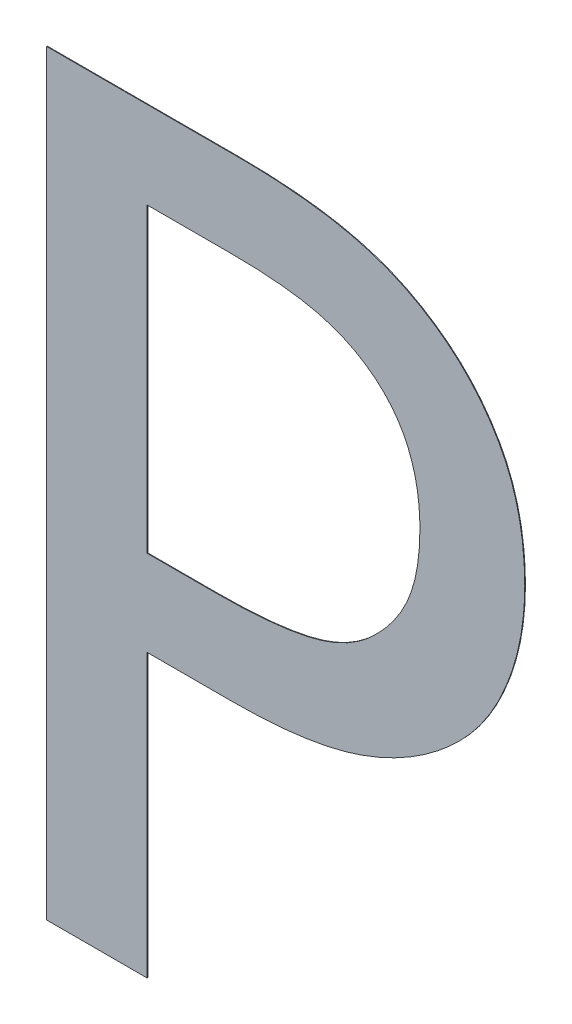
ISO-10303-21;
HEADER;
FILE_DESCRIPTION(('STEP AP214'),'2;1');
FILE_NAME('part.step','',(''),(''),'','','');
FILE_SCHEMA(('AUTOMOTIVE_DESIGN { 1 0 10303 214 1 1 1 1 }'));
ENDSEC;
DATA;
#1=APPLICATION_CONTEXT('core data for automotive mechanical design processes');
#2=APPLICATION_PROTOCOL_DEFINITION('international standard','automotive_design',2000,#1);
#3=PRODUCT_CONTEXT('',#1,'mechanical');
#4=PRODUCT('Part','Part','',(#3));
#5=PRODUCT_RELATED_PRODUCT_CATEGORY('part','',(#4));
#6=PRODUCT_DEFINITION_FORMATION('','',#4);
#7=PRODUCT_DEFINITION_CONTEXT('part definition',#1,'design');
#8=PRODUCT_DEFINITION('design','',#6,#7);
#9=PRODUCT_DEFINITION_SHAPE('','',#8);
#10=(LENGTH_UNIT() NAMED_UNIT(*) SI_UNIT(.MILLI.,.METRE.));
#11=(NAMED_UNIT(*) PLANE_ANGLE_UNIT() SI_UNIT($,.RADIAN.));
#12=(NAMED_UNIT(*) SI_UNIT($,.STERADIAN.) SOLID_ANGLE_UNIT());
#13=UNCERTAINTY_MEASURE_WITH_UNIT(LENGTH_MEASURE(1.E-05),#10,'distance_accuracy_value','');
#14=(GEOMETRIC_REPRESENTATION_CONTEXT(3) GLOBAL_UNCERTAINTY_ASSIGNED_CONTEXT((#13)) GLOBAL_UNIT_ASSIGNED_CONTEXT((#10,
#11,#12)) REPRESENTATION_CONTEXT('',''));
#15=CARTESIAN_POINT('',(0.,0.,0.));
#16=DIRECTION('',(0.,0.,1.));
#17=DIRECTION('',(1.,0.,0.));
#18=AXIS2_PLACEMENT_3D('',#15,#16,#17);
#19=CARTESIAN_POINT('',(-6.65565102340653,5.25210661835705,0.));
#20=CARTESIAN_POINT('',(-6.65565102340653,5.25210661835705,0.000333333333333333));
#21=CARTESIAN_POINT('',(-6.65565102340653,5.25210661835705,0.000666666666666667));
#22=CARTESIAN_POINT('',(-6.65565102340653,5.25210661835705,0.001));
#23=CARTESIAN_POINT('',(-6.63316317866353,5.27459446310005,0.));
#24=CARTESIAN_POINT('',(-6.63316317866353,5.27459446310005,0.000333333333333333));
#25=CARTESIAN_POINT('',(-6.63316317866353,5.27459446310005,0.000666666666666667));
#26=CARTESIAN_POINT('',(-6.63316317866353,5.27459446310005,0.001));
#27=CARTESIAN_POINT('',(-6.61690507469378,5.2990575915033,0.));
#28=CARTESIAN_POINT('',(-6.61690507469378,5.2990575915033,0.000333333333333333));
#29=CARTESIAN_POINT('',(-6.61690507469378,5.2990575915033,0.000666666666666667));
#30=CARTESIAN_POINT('',(-6.61690507469378,5.2990575915033,0.001));
#31=CARTESIAN_POINT('',(-6.59684834830078,5.3519344156303,0.));
#32=CARTESIAN_POINT('',(-6.59684834830078,5.3519344156303,0.000333333333333333));
#33=CARTESIAN_POINT('',(-6.59684834830078,5.3519344156303,0.000666666666666667));
#34=CARTESIAN_POINT('',(-6.59684834830078,5.3519344156303,0.001));
#35=CARTESIAN_POINT('',(-6.59183416670253,5.38308311949805,0.));
#36=CARTESIAN_POINT('',(-6.59183416670253,5.38308311949805,0.000333333333333334));
#37=CARTESIAN_POINT('',(-6.59183416670253,5.38308311949805,0.000666666666666666));
#38=CARTESIAN_POINT('',(-6.59183416670253,5.38308311949805,0.001));
#39=CARTESIAN_POINT('',(-6.59183416670253,5.41894211517005,0.));
#40=CARTESIAN_POINT('',(-6.59183416670253,5.41894211517005,0.000333333333333333));
#41=CARTESIAN_POINT('',(-6.59183416670253,5.41894211517005,0.000666666666666667));
#42=CARTESIAN_POINT('',(-6.59183416670253,5.41894211517005,0.001));
#43=B_SPLINE_SURFACE_WITH_KNOTS('',3,3,((#19,#20,#21,#22),(#23,#24,#25,#26),(#27,#28,#29,#30),
(#31,#32,#33,#34),(#35,#36,#37,#38),(#39,#40,#41,#42)),.UNSPECIFIED.,.F.,.F.,.F.,(4,2,4),(4,4),
(0.,1.,2.),(0.,0.0001),.UNSPECIFIED.);
#44=DIRECTION('',(0.,0.,1.));
#45=VECTOR('',#44,1.);
#46=CARTESIAN_POINT('',(-6.59183416670253,5.41894211517005,0.));
#47=LINE('',#46,#45);
#48=CARTESIAN_POINT('',(-6.59183416670253,5.41894211517005,0.));
#49=VERTEX_POINT('',#48);
#50=CARTESIAN_POINT('',(-6.59183416670253,5.41894211517005,0.001));
#51=VERTEX_POINT('',#50);
#52=EDGE_CURVE('E11',#49,#51,#47,.T.);
#53=CARTESIAN_POINT('',(-6.65565102340653,5.25210661835705,0.));
#54=CARTESIAN_POINT('',(-6.62191925629203,5.28583838547155,0.));
#55=CARTESIAN_POINT('',(-6.59183416670253,5.36515362166205,0.));
#56=CARTESIAN_POINT('',(-6.59183416670253,5.41894211517005,0.));
#57=B_SPLINE_CURVE_WITH_KNOTS('',2,(#53,#54,#55,#56),.UNSPECIFIED.,.F.,.F.,(3,1,3),(0.,1.,2.),.UNSPECIFIED.);
#58=CARTESIAN_POINT('',(-6.65565102340653,5.25210661835705,0.));
#59=VERTEX_POINT('',#58);
#60=EDGE_CURVE('E26',#59,#49,#57,.T.);
#61=DIRECTION('',(0.,0.,1.));
#62=VECTOR('',#61,1.);
#63=CARTESIAN_POINT('',(-6.65565102340653,5.25210661835705,0.));
#64=LINE('',#63,#62);
#65=CARTESIAN_POINT('',(-6.65565102340653,5.25210661835705,0.001));
#66=VERTEX_POINT('',#65);
#67=EDGE_CURVE('E331',#59,#66,#64,.T.);
#68=CARTESIAN_POINT('',(-6.59183416670253,5.41894211517005,0.001));
#69=CARTESIAN_POINT('',(-6.59183416670253,5.36515362166205,0.001));
#70=CARTESIAN_POINT('',(-6.62191925629203,5.28583838547155,0.001));
#71=CARTESIAN_POINT('',(-6.65565102340653,5.25210661835705,0.001));
#72=B_SPLINE_CURVE_WITH_KNOTS('',2,(#68,#69,#70,#71),.UNSPECIFIED.,.F.,.F.,(3,1,3),(-2.,-1.,0.),.UNSPECIFIED.);
#73=EDGE_CURVE('E39',#51,#66,#72,.T.);
#74=ORIENTED_EDGE('',*,*,#52,.F.);
#75=ORIENTED_EDGE('',*,*,#60,.F.);
#76=ORIENTED_EDGE('',*,*,#67,.T.);
#77=ORIENTED_EDGE('',*,*,#73,.F.);
#78=EDGE_LOOP('',(#74,#75,#76,#77));
#79=FACE_BOUND('',#78,.T.);
#80=ADVANCED_FACE('F17',(#79),#43,.F.);
#81=CARTESIAN_POINT('',(-6.89542007074053,5.18464308412605,0.));
#82=CARTESIAN_POINT('',(-6.89542007074053,5.18464308412605,0.000333333333333333));
#83=CARTESIAN_POINT('',(-6.89542007074053,5.18464308412605,0.000666666666666667));
#84=CARTESIAN_POINT('',(-6.89542007074053,5.18464308412605,0.001));
#85=CARTESIAN_POINT('',(-6.83464211197353,5.18464308412605,0.));
#86=CARTESIAN_POINT('',(-6.83464211197353,5.18464308412605,0.000333333333333333));
#87=CARTESIAN_POINT('',(-6.83464211197353,5.18464308412605,0.000666666666666667));
#88=CARTESIAN_POINT('',(-6.83464211197353,5.18464308412605,0.001));
#89=CARTESIAN_POINT('',(-6.78556391026953,5.18950532082738,0.));
#90=CARTESIAN_POINT('',(-6.78556391026953,5.18950532082738,0.000333333333333333));
#91=CARTESIAN_POINT('',(-6.78556391026953,5.18950532082738,0.000666666666666667));
#92=CARTESIAN_POINT('',(-6.78556391026953,5.18950532082738,0.001));
#93=CARTESIAN_POINT('',(-6.71080702098753,5.20895426763271,0.));
#94=CARTESIAN_POINT('',(-6.71080702098753,5.20895426763271,0.000333333333333333));
#95=CARTESIAN_POINT('',(-6.71080702098753,5.20895426763271,0.000666666666666667));
#96=CARTESIAN_POINT('',(-6.71080702098753,5.20895426763271,0.001));
#97=CARTESIAN_POINT('',(-6.67996220691353,5.22657987567505,0.));
#98=CARTESIAN_POINT('',(-6.67996220691353,5.22657987567505,0.000333333333333334));
#99=CARTESIAN_POINT('',(-6.67996220691353,5.22657987567505,0.000666666666666666));
#100=CARTESIAN_POINT('',(-6.67996220691353,5.22657987567505,0.001));
#101=CARTESIAN_POINT('',(-6.65565102340653,5.25210661835705,0.));
#102=CARTESIAN_POINT('',(-6.65565102340653,5.25210661835705,0.000333333333333333));
#103=CARTESIAN_POINT('',(-6.65565102340653,5.25210661835705,0.000666666666666667));
#104=CARTESIAN_POINT('',(-6.65565102340653,5.25210661835705,0.001));
#105=B_SPLINE_SURFACE_WITH_KNOTS('',3,3,((#81,#82,#83,#84),(#85,#86,#87,#88),(#89,#90,#91,#92),
(#93,#94,#95,#96),(#97,#98,#99,#100),(#101,#102,#103,#104)),.UNSPECIFIED.,.F.,.F.,.F.,(4,2,4),
(4,4),(0.,1.,2.),(0.,0.0001),.UNSPECIFIED.);
#106=CARTESIAN_POINT('',(-6.89542007074053,5.18464308412605,0.));
#107=CARTESIAN_POINT('',(-6.80425313259003,5.18464308412605,0.));
#108=CARTESIAN_POINT('',(-6.69211779866703,5.21381650433405,0.));
#109=CARTESIAN_POINT('',(-6.65565102340653,5.25210661835705,0.));
#110=B_SPLINE_CURVE_WITH_KNOTS('',2,(#106,#107,#108,#109),.UNSPECIFIED.,.F.,.F.,(3,1,3),(0.,1.,
2.),.UNSPECIFIED.);
#111=CARTESIAN_POINT('',(-6.89542007074053,5.18464308412605,0.));
#112=VERTEX_POINT('',#111);
#113=EDGE_CURVE('E321',#112,#59,#110,.T.);
#114=DIRECTION('',(0.,0.,1.));
#115=VECTOR('',#114,1.);
#116=CARTESIAN_POINT('',(-6.89542007074053,5.18464308412605,0.));
#117=LINE('',#116,#115);
#118=CARTESIAN_POINT('',(-6.89542007074053,5.18464308412605,0.001));
#119=VERTEX_POINT('',#118);
#120=EDGE_CURVE('E315',#112,#119,#117,.T.);
#121=CARTESIAN_POINT('',(-6.65565102340653,5.25210661835705,0.001));
#122=CARTESIAN_POINT('',(-6.69211779866703,5.21381650433405,0.001));
#123=CARTESIAN_POINT('',(-6.80425313259003,5.18464308412605,0.001));
#124=CARTESIAN_POINT('',(-6.89542007074053,5.18464308412605,0.001));
#125=B_SPLINE_CURVE_WITH_KNOTS('',2,(#121,#122,#123,#124),.UNSPECIFIED.,.F.,.F.,(3,1,3),(-2.,
-1.,0.),.UNSPECIFIED.);
#126=EDGE_CURVE('E311',#66,#119,#125,.T.);
#127=ORIENTED_EDGE('',*,*,#67,.F.);
#128=ORIENTED_EDGE('',*,*,#113,.F.);
#129=ORIENTED_EDGE('',*,*,#120,.T.);
#130=ORIENTED_EDGE('',*,*,#126,.F.);
#131=EDGE_LOOP('',(#127,#128,#129,#130));
#132=FACE_BOUND('',#131,.T.);
#133=ADVANCED_FACE('F343',(#132),#105,.F.);
#134=CARTESIAN_POINT('',(-6.94647355610403,5.18464308412605,0.));
#135=DIRECTION('',(0.,-1.,0.));
#136=DIRECTION('',(0.,0.,-1.));
#137=AXIS2_PLACEMENT_3D('',#134,#135,#136);
#138=PLANE('',#137);
#139=DIRECTION('',(1.,0.,0.));
#140=VECTOR('',#139,1.);
#141=CARTESIAN_POINT('',(-6.99752704146753,5.18464308412605,0.));
#142=LINE('',#141,#140);
#143=CARTESIAN_POINT('',(-6.99752704146753,5.18464308412605,0.));
#144=VERTEX_POINT('',#143);
#145=EDGE_CURVE('E308',#144,#112,#142,.T.);
#146=ORIENTED_EDGE('',*,*,#145,.F.);
#147=DIRECTION('',(0.,0.,1.));
#148=VECTOR('',#147,1.);
#149=CARTESIAN_POINT('',(-6.99752704146753,5.18464308412605,0.));
#150=LINE('',#149,#148);
#151=CARTESIAN_POINT('',(-6.99752704146753,5.18464308412605,0.001));
#152=VERTEX_POINT('',#151);
#153=EDGE_CURVE('E306',#144,#152,#150,.T.);
#154=ORIENTED_EDGE('',*,*,#153,.T.);
#155=DIRECTION('',(-1.,0.,0.));
#156=VECTOR('',#155,1.);
#157=CARTESIAN_POINT('',(-6.89542007074053,5.18464308412605,0.001));
#158=LINE('',#157,#156);
#159=EDGE_CURVE('E303',#119,#152,#158,.T.);
#160=ORIENTED_EDGE('',*,*,#159,.F.);
#161=ORIENTED_EDGE('',*,*,#120,.F.);
#162=EDGE_LOOP('',(#146,#154,#160,#161));
#163=FACE_BOUND('',#162,.T.);
#164=ADVANCED_FACE('F364',(#163),#138,.F.);
#165=CARTESIAN_POINT('',(-6.99752704146753,5.4089137519738,0.));
#166=DIRECTION('',(-1.,0.,0.));
#167=DIRECTION('',(0.,0.,1.));
#168=AXIS2_PLACEMENT_3D('',#165,#166,#167);
#169=PLANE('',#168);
#170=DIRECTION('',(0.,-1.,0.));
#171=VECTOR('',#170,1.);
#172=CARTESIAN_POINT('',(-6.99752704146753,5.63318441982155,0.));
#173=LINE('',#172,#171);
#174=CARTESIAN_POINT('',(-6.99752704146753,5.63318441982155,0.));
#175=VERTEX_POINT('',#174);
#176=EDGE_CURVE('E300',#175,#144,#173,.T.);
#177=ORIENTED_EDGE('',*,*,#176,.F.);
#178=DIRECTION('',(0.,0.,1.));
#179=VECTOR('',#178,1.);
#180=CARTESIAN_POINT('',(-6.99752704146753,5.63318441982155,0.));
#181=LINE('',#180,#179);
#182=CARTESIAN_POINT('',(-6.99752704146753,5.63318441982155,0.001));
#183=VERTEX_POINT('',#182);
#184=EDGE_CURVE('E298',#175,#183,#181,.T.);
#185=ORIENTED_EDGE('',*,*,#184,.T.);
#186=DIRECTION('',(0.,1.,0.));
#187=VECTOR('',#186,1.);
#188=CARTESIAN_POINT('',(-6.99752704146753,5.18464308412605,0.001));
#189=LINE('',#188,#187);
#190=EDGE_CURVE('E295',#152,#183,#189,.T.);
#191=ORIENTED_EDGE('',*,*,#190,.F.);
#192=ORIENTED_EDGE('',*,*,#153,.F.);
#193=EDGE_LOOP('',(#177,#185,#191,#192));
#194=FACE_BOUND('',#193,.T.);
#195=ADVANCED_FACE('F362',(#194),#169,.F.);
#196=CARTESIAN_POINT('',(-6.93553352352603,5.63318441982155,0.));
#197=DIRECTION('',(0.,1.,0.));
#198=DIRECTION('',(0.,0.,1.));
#199=AXIS2_PLACEMENT_3D('',#196,#197,#198);
#200=PLANE('',#199);
#201=DIRECTION('',(-1.,0.,0.));
#202=VECTOR('',#201,1.);
#203=CARTESIAN_POINT('',(-6.87354000558453,5.63318441982155,0.));
#204=LINE('',#203,#202);
#205=CARTESIAN_POINT('',(-6.87354000558453,5.63318441982155,0.));
#206=VERTEX_POINT('',#205);
#207=EDGE_CURVE('E292',#206,#175,#204,.T.);
#208=ORIENTED_EDGE('',*,*,#207,.F.);
#209=DIRECTION('',(0.,0.,1.));
#210=VECTOR('',#209,1.);
#211=CARTESIAN_POINT('',(-6.87354000558453,5.63318441982155,0.));
#212=LINE('',#211,#210);
#213=CARTESIAN_POINT('',(-6.87354000558453,5.63318441982155,0.001));
#214=VERTEX_POINT('',#213);
#215=EDGE_CURVE('E290',#206,#214,#212,.T.);
#216=ORIENTED_EDGE('',*,*,#215,.T.);
#217=DIRECTION('',(1.,0.,0.));
#218=VECTOR('',#217,1.);
#219=CARTESIAN_POINT('',(-6.99752704146753,5.63318441982155,0.001));
#220=LINE('',#219,#218);
#221=EDGE_CURVE('E284',#183,#214,#220,.T.);
#222=ORIENTED_EDGE('',*,*,#221,.F.);
#223=ORIENTED_EDGE('',*,*,#184,.F.);
#224=EDGE_LOOP('',(#208,#216,#222,#223));
#225=FACE_BOUND('',#224,.T.);
#226=ADVANCED_FACE('F358',(#225),#200,.F.);
#227=CARTESIAN_POINT('',(-6.67297274165553,5.59033595889155,0.));
#228=CARTESIAN_POINT('',(-6.67297274165553,5.59033595889155,0.000333333333333333));
#229=CARTESIAN_POINT('',(-6.67297274165553,5.59033595889155,0.000666666666666667));
#230=CARTESIAN_POINT('',(-6.67297274165553,5.59033595889155,0.001));
#231=CARTESIAN_POINT('',(-6.69667614557453,5.60613822817055,0.));
#232=CARTESIAN_POINT('',(-6.69667614557453,5.60613822817055,0.000333333333333333));
#233=CARTESIAN_POINT('',(-6.69667614557453,5.60613822817055,0.000666666666666667));
#234=CARTESIAN_POINT('',(-6.69667614557453,5.60613822817055,0.001));
#235=CARTESIAN_POINT('',(-6.72433011681328,5.6172302056453,0.));
#236=CARTESIAN_POINT('',(-6.72433011681328,5.6172302056453,0.000333333333333333));
#237=CARTESIAN_POINT('',(-6.72433011681328,5.6172302056453,0.000666666666666667));
#238=CARTESIAN_POINT('',(-6.72433011681328,5.6172302056453,0.001));
#239=CARTESIAN_POINT('',(-6.78753919393028,5.62999357698629,0.));
#240=CARTESIAN_POINT('',(-6.78753919393028,5.62999357698629,0.000333333333333333));
#241=CARTESIAN_POINT('',(-6.78753919393028,5.62999357698629,0.000666666666666667));
#242=CARTESIAN_POINT('',(-6.78753919393028,5.62999357698629,0.001));
#243=CARTESIAN_POINT('',(-6.82674097733453,5.63318441982155,0.));
#244=CARTESIAN_POINT('',(-6.82674097733453,5.63318441982155,0.000333333333333334));
#245=CARTESIAN_POINT('',(-6.82674097733453,5.63318441982155,0.000666666666666666));
#246=CARTESIAN_POINT('',(-6.82674097733453,5.63318441982155,0.001));
#247=CARTESIAN_POINT('',(-6.87354000558453,5.63318441982155,0.));
#248=CARTESIAN_POINT('',(-6.87354000558453,5.63318441982155,0.000333333333333333));
#249=CARTESIAN_POINT('',(-6.87354000558453,5.63318441982155,0.000666666666666667));
#250=CARTESIAN_POINT('',(-6.87354000558453,5.63318441982155,0.001));
#251=B_SPLINE_SURFACE_WITH_KNOTS('',3,3,((#227,#228,#229,#230),(#231,#232,#233,#234),(#235,#236,
#237,#238),(#239,#240,#241,#242),(#243,#244,#245,#246),(#247,#248,#249,#250)),.UNSPECIFIED.,.F.,
.F.,.F.,(4,2,4),(4,4),(0.,1.,2.),(0.,0.0001),.UNSPECIFIED.);
#252=CARTESIAN_POINT('',(-6.67297274165553,5.59033595889155,0.));
#253=CARTESIAN_POINT('',(-6.70852784753403,5.61403936281005,0.));
#254=CARTESIAN_POINT('',(-6.80334146320953,5.63318441982155,0.));
#255=CARTESIAN_POINT('',(-6.87354000558453,5.63318441982155,0.));
#256=B_SPLINE_CURVE_WITH_KNOTS('',2,(#252,#253,#254,#255),.UNSPECIFIED.,.F.,.F.,(3,1,3),(0.,1.,
2.),.UNSPECIFIED.);
#257=CARTESIAN_POINT('',(-6.67297274165553,5.59033595889155,0.));
#258=VERTEX_POINT('',#257);
#259=EDGE_CURVE('E279',#258,#206,#256,.T.);
#260=DIRECTION('',(0.,0.,1.));
#261=VECTOR('',#260,1.);
#262=CARTESIAN_POINT('',(-6.67297274165553,5.59033595889155,0.));
#263=LINE('',#262,#261);
#264=CARTESIAN_POINT('',(-6.67297274165553,5.59033595889155,0.001));
#265=VERTEX_POINT('',#264);
#266=EDGE_CURVE('E273',#258,#265,#263,.T.);
#267=CARTESIAN_POINT('',(-6.87354000558453,5.63318441982155,0.001));
#268=CARTESIAN_POINT('',(-6.80334146320953,5.63318441982155,0.001));
#269=CARTESIAN_POINT('',(-6.70852784753403,5.61403936281005,0.001));
#270=CARTESIAN_POINT('',(-6.67297274165553,5.59033595889155,0.001));
#271=B_SPLINE_CURVE_WITH_KNOTS('',2,(#267,#268,#269,#270),.UNSPECIFIED.,.F.,.F.,(3,1,3),(-2.,
-1.,0.),.UNSPECIFIED.);
#272=EDGE_CURVE('E266',#214,#265,#271,.T.);
#273=ORIENTED_EDGE('',*,*,#215,.F.);
#274=ORIENTED_EDGE('',*,*,#259,.F.);
#275=ORIENTED_EDGE('',*,*,#266,.T.);
#276=ORIENTED_EDGE('',*,*,#272,.F.);
#277=EDGE_LOOP('',(#273,#274,#275,#276));
#278=FACE_BOUND('',#277,.T.);
#279=ADVANCED_FACE('F355',(#278),#251,.F.);
#280=CARTESIAN_POINT('',(-6.59183416670253,5.41894211517005,0.));
#281=CARTESIAN_POINT('',(-6.59183416670253,5.41894211517005,0.000333333333333333));
#282=CARTESIAN_POINT('',(-6.59183416670253,5.41894211517005,0.000666666666666667));
#283=CARTESIAN_POINT('',(-6.59183416670253,5.41894211517005,0.001));
#284=CARTESIAN_POINT('',(-6.59183416670253,5.45784000878005,0.));
#285=CARTESIAN_POINT('',(-6.59183416670253,5.45784000878005,0.000333333333333333));
#286=CARTESIAN_POINT('',(-6.59183416670253,5.45784000878005,0.000666666666666667));
#287=CARTESIAN_POINT('',(-6.59183416670253,5.45784000878005,0.001));
#288=CARTESIAN_POINT('',(-6.59851974216678,5.4915717758953,0.));
#289=CARTESIAN_POINT('',(-6.59851974216678,5.4915717758953,0.000333333333333333));
#290=CARTESIAN_POINT('',(-6.59851974216678,5.4915717758953,0.000666666666666667));
#291=CARTESIAN_POINT('',(-6.59851974216678,5.4915717758953,0.001));
#292=CARTESIAN_POINT('',(-6.62526204402378,5.5487030571363,0.));
#293=CARTESIAN_POINT('',(-6.62526204402378,5.5487030571363,0.000333333333333333));
#294=CARTESIAN_POINT('',(-6.62526204402378,5.5487030571363,0.000666666666666667));
#295=CARTESIAN_POINT('',(-6.62526204402378,5.5487030571363,0.001));
#296=CARTESIAN_POINT('',(-6.64562266021053,5.57210257126155,0.));
#297=CARTESIAN_POINT('',(-6.64562266021053,5.57210257126155,0.000333333333333334));
#298=CARTESIAN_POINT('',(-6.64562266021053,5.57210257126155,0.000666666666666666));
#299=CARTESIAN_POINT('',(-6.64562266021053,5.57210257126155,0.001));
#300=CARTESIAN_POINT('',(-6.67297274165553,5.59033595889155,0.));
#301=CARTESIAN_POINT('',(-6.67297274165553,5.59033595889155,0.000333333333333333));
#302=CARTESIAN_POINT('',(-6.67297274165553,5.59033595889155,0.000666666666666667));
#303=CARTESIAN_POINT('',(-6.67297274165553,5.59033595889155,0.001));
#304=B_SPLINE_SURFACE_WITH_KNOTS('',3,3,((#280,#281,#282,#283),(#284,#285,#286,#287),(#288,#289,
#290,#291),(#292,#293,#294,#295),(#296,#297,#298,#299),(#300,#301,#302,#303)),.UNSPECIFIED.,.F.,
.F.,.F.,(4,2,4),(4,4),(0.,1.,2.),(0.,0.0001),.UNSPECIFIED.);
#305=CARTESIAN_POINT('',(-6.59183416670253,5.41894211517005,0.));
#306=CARTESIAN_POINT('',(-6.59183416670253,5.47728895558505,0.));
#307=CARTESIAN_POINT('',(-6.63194761948803,5.56298587744655,0.));
#308=CARTESIAN_POINT('',(-6.67297274165553,5.59033595889155,0.));
#309=B_SPLINE_CURVE_WITH_KNOTS('',2,(#305,#306,#307,#308),.UNSPECIFIED.,.F.,.F.,(3,1,3),(0.,1.,
2.),.UNSPECIFIED.);
#310=EDGE_CURVE('E259',#49,#258,#309,.T.);
#311=CARTESIAN_POINT('',(-6.67297274165553,5.59033595889155,0.001));
#312=CARTESIAN_POINT('',(-6.63194761948803,5.56298587744655,0.001));
#313=CARTESIAN_POINT('',(-6.59183416670253,5.47728895558505,0.001));
#314=CARTESIAN_POINT('',(-6.59183416670253,5.41894211517005,0.001));
#315=B_SPLINE_CURVE_WITH_KNOTS('',2,(#311,#312,#313,#314),.UNSPECIFIED.,.F.,.F.,(3,1,3),(-2.,
-1.,0.),.UNSPECIFIED.);
#316=EDGE_CURVE('E251',#265,#51,#315,.T.);
#317=ORIENTED_EDGE('',*,*,#266,.F.);
#318=ORIENTED_EDGE('',*,*,#310,.F.);
#319=ORIENTED_EDGE('',*,*,#52,.T.);
#320=ORIENTED_EDGE('',*,*,#316,.F.);
#321=EDGE_LOOP('',(#317,#318,#319,#320));
#322=FACE_BOUND('',#321,.T.);
#323=ADVANCED_FACE('F349',(#322),#304,.F.);
#324=CARTESIAN_POINT('',(-6.87080499744003,5.05700937071687,0.));
#325=CARTESIAN_POINT('',(-6.87080499744003,5.05700937071687,0.000333333333333333));
#326=CARTESIAN_POINT('',(-6.87080499744003,5.05700937071687,0.000666666666666667));
#327=CARTESIAN_POINT('',(-6.87080499744003,5.05700937071687,0.001));
#328=CARTESIAN_POINT('',(-6.79057809186803,5.05700937071687,0.));
#329=CARTESIAN_POINT('',(-6.79057809186803,5.05700937071687,0.000333333333333333));
#330=CARTESIAN_POINT('',(-6.79057809186803,5.05700937071687,0.000666666666666667));
#331=CARTESIAN_POINT('',(-6.79057809186803,5.05700937071687,0.001));
#332=CARTESIAN_POINT('',(-6.72417817191578,5.06688578901639,0.));
#333=CARTESIAN_POINT('',(-6.72417817191578,5.06688578901639,0.000333333333333333));
#334=CARTESIAN_POINT('',(-6.72417817191578,5.06688578901639,0.000666666666666667));
#335=CARTESIAN_POINT('',(-6.72417817191578,5.06688578901639,0.001));
#336=CARTESIAN_POINT('',(-6.61903230325078,5.10639146221447,0.));
#337=CARTESIAN_POINT('',(-6.61903230325078,5.10639146221447,0.000333333333333333));
#338=CARTESIAN_POINT('',(-6.61903230325078,5.10639146221447,0.000666666666666667));
#339=CARTESIAN_POINT('',(-6.61903230325078,5.10639146221447,0.001));
#340=CARTESIAN_POINT('',(-6.57329688927903,5.13541293752537,0.));
#341=CARTESIAN_POINT('',(-6.57329688927903,5.13541293752537,0.000333333333333333));
#342=CARTESIAN_POINT('',(-6.57329688927903,5.13541293752537,0.000666666666666667));
#343=CARTESIAN_POINT('',(-6.57329688927903,5.13541293752537,0.001));
#344=CARTESIAN_POINT('',(-6.53439899566803,5.17370305154813,0.));
#345=CARTESIAN_POINT('',(-6.53439899566803,5.17370305154813,0.000333333333333333));
#346=CARTESIAN_POINT('',(-6.53439899566803,5.17370305154813,0.000666666666666667));
#347=CARTESIAN_POINT('',(-6.53439899566803,5.17370305154813,0.001));
#348=B_SPLINE_SURFACE_WITH_KNOTS('',3,3,((#324,#325,#326,#327),(#328,#329,#330,#331),(#332,#333,
#334,#335),(#336,#337,#338,#339),(#340,#341,#342,#343),(#344,#345,#346,#347)),.UNSPECIFIED.,.F.,
.F.,.F.,(4,2,4),(4,4),(-2.,-1.,0.),(0.,0.0001),.UNSPECIFIED.);
#349=CARTESIAN_POINT('',(-6.53439899566803,5.17370305154813,0.));
#350=CARTESIAN_POINT('',(-6.59274583608453,5.11626788051399,0.));
#351=CARTESIAN_POINT('',(-6.75046463908203,5.05700937071687,0.));
#352=CARTESIAN_POINT('',(-6.87080499744003,5.05700937071687,0.));
#353=B_SPLINE_CURVE_WITH_KNOTS('',2,(#349,#350,#351,#352),.UNSPECIFIED.,.F.,.F.,(3,1,3),(0.,1.,
2.),.UNSPECIFIED.);
#354=CARTESIAN_POINT('',(-6.53439899566803,5.17370305154813,0.));
#355=VERTEX_POINT('',#354);
#356=CARTESIAN_POINT('',(-6.87080499744003,5.05700937071687,0.));
#357=VERTEX_POINT('',#356);
#358=EDGE_CURVE('E247',#355,#357,#353,.T.);
#359=DIRECTION('',(0.,0.,1.));
#360=VECTOR('',#359,1.);
#361=CARTESIAN_POINT('',(-6.53439899566803,5.17370305154813,0.));
#362=LINE('',#361,#360);
#363=CARTESIAN_POINT('',(-6.53439899566803,5.17370305154813,0.001));
#364=VERTEX_POINT('',#363);
#365=EDGE_CURVE('E242',#355,#364,#362,.T.);
#366=CARTESIAN_POINT('',(-6.87080499744003,5.05700937071687,0.001));
#367=CARTESIAN_POINT('',(-6.75046463908203,5.05700937071687,0.001));
#368=CARTESIAN_POINT('',(-6.59274583608453,5.11626788051399,0.001));
#369=CARTESIAN_POINT('',(-6.53439899566803,5.17370305154813,0.001));
#370=B_SPLINE_CURVE_WITH_KNOTS('',2,(#366,#367,#368,#369),.UNSPECIFIED.,.F.,.F.,(3,1,3),(-2.,
-1.,0.),.UNSPECIFIED.);
#371=CARTESIAN_POINT('',(-6.87080499744003,5.05700937071687,0.001));
#372=VERTEX_POINT('',#371);
#373=EDGE_CURVE('E157',#372,#364,#370,.T.);
#374=DIRECTION('',(0.,0.,1.));
#375=VECTOR('',#374,1.);
#376=CARTESIAN_POINT('',(-6.87080499744003,5.05700937071687,0.));
#377=LINE('',#376,#375);
#378=EDGE_CURVE('E236',#357,#372,#377,.T.);
#379=ORIENTED_EDGE('',*,*,#358,.F.);
#380=ORIENTED_EDGE('',*,*,#365,.T.);
#381=ORIENTED_EDGE('',*,*,#373,.F.);
#382=ORIENTED_EDGE('',*,*,#378,.F.);
#383=EDGE_LOOP('',(#379,#380,#381,#382));
#384=FACE_BOUND('',#383,.T.);
#385=ADVANCED_FACE('F423',(#384),#348,.T.);
#386=CARTESIAN_POINT('',(-6.93416601945378,5.05700937071687,0.));
#387=DIRECTION('',(0.,-1.,0.));
#388=DIRECTION('',(0.,0.,-1.));
#389=AXIS2_PLACEMENT_3D('',#386,#387,#388);
#390=PLANE('',#389);
#391=DIRECTION('',(-1.,0.,0.));
#392=VECTOR('',#391,1.);
#393=CARTESIAN_POINT('',(-6.87080499744003,5.05700937071687,0.));
#394=LINE('',#393,#392);
#395=CARTESIAN_POINT('',(-6.99752704146753,5.05700937071687,0.));
#396=VERTEX_POINT('',#395);
#397=EDGE_CURVE('E234',#357,#396,#394,.T.);
#398=ORIENTED_EDGE('',*,*,#397,.F.);
#399=ORIENTED_EDGE('',*,*,#378,.T.);
#400=DIRECTION('',(1.,0.,0.));
#401=VECTOR('',#400,1.);
#402=CARTESIAN_POINT('',(-6.99752704146753,5.05700937071687,0.001));
#403=LINE('',#402,#401);
#404=CARTESIAN_POINT('',(-6.99752704146753,5.05700937071687,0.001));
#405=VERTEX_POINT('',#404);
#406=EDGE_CURVE('E232',#405,#372,#403,.T.);
#407=ORIENTED_EDGE('',*,*,#406,.F.);
#408=DIRECTION('',(0.,0.,1.));
#409=VECTOR('',#408,1.);
#410=CARTESIAN_POINT('',(-6.99752704146753,5.05700937071687,0.));
#411=LINE('',#410,#409);
#412=EDGE_CURVE('E229',#396,#405,#411,.T.);
#413=ORIENTED_EDGE('',*,*,#412,.F.);
#414=EDGE_LOOP('',(#398,#399,#407,#413));
#415=FACE_BOUND('',#414,.T.);
#416=ADVANCED_FACE('F432',(#415),#390,.T.);
#417=CARTESIAN_POINT('',(-6.99752704146753,4.84732541297321,0.));
#418=DIRECTION('',(1.,0.,0.));
#419=DIRECTION('',(0.,0.,-1.));
#420=AXIS2_PLACEMENT_3D('',#417,#418,#419);
#421=PLANE('',#420);
#422=DIRECTION('',(0.,-1.,0.));
#423=VECTOR('',#422,1.);
#424=CARTESIAN_POINT('',(-6.99752704146753,5.05700937071687,0.));
#425=LINE('',#424,#423);
#426=CARTESIAN_POINT('',(-6.99752704146753,4.63764145522955,0.));
#427=VERTEX_POINT('',#426);
#428=EDGE_CURVE('E227',#396,#427,#425,.T.);
#429=ORIENTED_EDGE('',*,*,#428,.F.);
#430=ORIENTED_EDGE('',*,*,#412,.T.);
#431=DIRECTION('',(0.,1.,0.));
#432=VECTOR('',#431,1.);
#433=CARTESIAN_POINT('',(-6.99752704146753,4.63764145522955,0.001));
#434=LINE('',#433,#432);
#435=CARTESIAN_POINT('',(-6.99752704146753,4.63764145522955,0.001));
#436=VERTEX_POINT('',#435);
#437=EDGE_CURVE('E224',#436,#405,#434,.T.);
#438=ORIENTED_EDGE('',*,*,#437,.F.);
#439=DIRECTION('',(0.,0.,1.));
#440=VECTOR('',#439,1.);
#441=CARTESIAN_POINT('',(-6.99752704146753,4.63764145522955,0.));
#442=LINE('',#441,#440);
#443=EDGE_CURVE('E221',#427,#436,#442,.T.);
#444=ORIENTED_EDGE('',*,*,#443,.F.);
#445=EDGE_LOOP('',(#429,#430,#438,#444));
#446=FACE_BOUND('',#445,.T.);
#447=ADVANCED_FACE('F442',(#446),#421,.T.);
#448=CARTESIAN_POINT('',(-7.07228393075028,4.63764145522955,0.));
#449=DIRECTION('',(0.,-1.,0.));
#450=DIRECTION('',(0.,0.,-1.));
#451=AXIS2_PLACEMENT_3D('',#448,#449,#450);
#452=PLANE('',#451);
#453=DIRECTION('',(-1.,0.,0.));
#454=VECTOR('',#453,1.);
#455=CARTESIAN_POINT('',(-6.99752704146753,4.63764145522955,0.));
#456=LINE('',#455,#454);
#457=CARTESIAN_POINT('',(-7.14704082003303,4.63764145522955,0.));
#458=VERTEX_POINT('',#457);
#459=EDGE_CURVE('E219',#427,#458,#456,.T.);
#460=ORIENTED_EDGE('',*,*,#459,.F.);
#461=ORIENTED_EDGE('',*,*,#443,.T.);
#462=DIRECTION('',(1.,0.,0.));
#463=VECTOR('',#462,1.);
#464=CARTESIAN_POINT('',(-7.14704082003303,4.63764145522955,0.001));
#465=LINE('',#464,#463);
#466=CARTESIAN_POINT('',(-7.14704082003303,4.63764145522955,0.001));
#467=VERTEX_POINT('',#466);
#468=EDGE_CURVE('E216',#467,#436,#465,.T.);
#469=ORIENTED_EDGE('',*,*,#468,.F.);
#470=DIRECTION('',(0.,0.,1.));
#471=VECTOR('',#470,1.);
#472=CARTESIAN_POINT('',(-7.14704082003303,4.63764145522955,0.));
#473=LINE('',#472,#471);
#474=EDGE_CURVE('E213',#458,#467,#473,.T.);
#475=ORIENTED_EDGE('',*,*,#474,.F.);
#476=EDGE_LOOP('',(#460,#461,#469,#475));
#477=FACE_BOUND('',#476,.T.);
#478=ADVANCED_FACE('F452',(#477),#452,.T.);
#479=CARTESIAN_POINT('',(-7.14704082003303,5.20014146361155,0.));
#480=DIRECTION('',(-1.,0.,0.));
#481=DIRECTION('',(0.,0.,1.));
#482=AXIS2_PLACEMENT_3D('',#479,#480,#481);
#483=PLANE('',#482);
#484=DIRECTION('',(0.,1.,0.));
#485=VECTOR('',#484,1.);
#486=CARTESIAN_POINT('',(-7.14704082003303,4.63764145522955,0.));
#487=LINE('',#486,#485);
#488=CARTESIAN_POINT('',(-7.14704082003303,5.76264147199355,0.));
#489=VERTEX_POINT('',#488);
#490=EDGE_CURVE('E211',#458,#489,#487,.T.);
#491=ORIENTED_EDGE('',*,*,#490,.F.);
#492=ORIENTED_EDGE('',*,*,#474,.T.);
#493=DIRECTION('',(0.,-1.,0.));
#494=VECTOR('',#493,1.);
#495=CARTESIAN_POINT('',(-7.14704082003303,5.76264147199355,0.001));
#496=LINE('',#495,#494);
#497=CARTESIAN_POINT('',(-7.14704082003303,5.76264147199355,0.001));
#498=VERTEX_POINT('',#497);
#499=EDGE_CURVE('E208',#498,#467,#496,.T.);
#500=ORIENTED_EDGE('',*,*,#499,.F.);
#501=DIRECTION('',(0.,0.,1.));
#502=VECTOR('',#501,1.);
#503=CARTESIAN_POINT('',(-7.14704082003303,5.76264147199355,0.));
#504=LINE('',#503,#502);
#505=EDGE_CURVE('E205',#489,#498,#504,.T.);
#506=ORIENTED_EDGE('',*,*,#505,.F.);
#507=EDGE_LOOP('',(#491,#492,#500,#506));
#508=FACE_BOUND('',#507,.T.);
#509=ADVANCED_FACE('F462',(#508),#483,.T.);
#510=CARTESIAN_POINT('',(-7.00573206590103,5.76264147199355,0.));
#511=DIRECTION('',(0.,1.,0.));
#512=DIRECTION('',(0.,0.,1.));
#513=AXIS2_PLACEMENT_3D('',#510,#511,#512);
#514=PLANE('',#513);
#515=DIRECTION('',(1.,0.,0.));
#516=VECTOR('',#515,1.);
#517=CARTESIAN_POINT('',(-7.14704082003303,5.76264147199355,0.));
#518=LINE('',#517,#516);
#519=CARTESIAN_POINT('',(-6.86442331176903,5.76264147199355,0.));
#520=VERTEX_POINT('',#519);
#521=EDGE_CURVE('E203',#489,#520,#518,.T.);
#522=ORIENTED_EDGE('',*,*,#521,.F.);
#523=ORIENTED_EDGE('',*,*,#505,.T.);
#524=DIRECTION('',(-1.,0.,0.));
#525=VECTOR('',#524,1.);
#526=CARTESIAN_POINT('',(-6.86442331176903,5.76264147199355,0.001));
#527=LINE('',#526,#525);
#528=CARTESIAN_POINT('',(-6.86442331176903,5.76264147199355,0.001));
#529=VERTEX_POINT('',#528);
#530=EDGE_CURVE('E200',#529,#498,#527,.T.);
#531=ORIENTED_EDGE('',*,*,#530,.F.);
#532=DIRECTION('',(0.,0.,1.));
#533=VECTOR('',#532,1.);
#534=CARTESIAN_POINT('',(-6.86442331176903,5.76264147199355,0.));
#535=LINE('',#534,#533);
#536=EDGE_CURVE('E194',#520,#529,#535,.T.);
#537=ORIENTED_EDGE('',*,*,#536,.F.);
#538=EDGE_LOOP('',(#522,#523,#531,#537));
#539=FACE_BOUND('',#538,.T.);
#540=ADVANCED_FACE('F472',(#539),#514,.T.);
#541=CARTESIAN_POINT('',(-6.56995410154653,5.69244292961855,0.));
#542=CARTESIAN_POINT('',(-6.56995410154653,5.69244292961855,0.000333333333333333));
#543=CARTESIAN_POINT('',(-6.56995410154653,5.69244292961855,0.000666666666666667));
#544=CARTESIAN_POINT('',(-6.56995410154653,5.69244292961855,0.001));
#545=CARTESIAN_POINT('',(-6.60581309721853,5.71736189271255,0.));
#546=CARTESIAN_POINT('',(-6.60581309721853,5.71736189271255,0.000333333333333333));
#547=CARTESIAN_POINT('',(-6.60581309721853,5.71736189271255,0.000666666666666667));
#548=CARTESIAN_POINT('',(-6.60581309721853,5.71736189271255,0.001));
#549=CARTESIAN_POINT('',(-6.64714210917953,5.73529139054855,0.));
#550=CARTESIAN_POINT('',(-6.64714210917953,5.73529139054855,0.000333333333333333));
#551=CARTESIAN_POINT('',(-6.64714210917953,5.73529139054855,0.000666666666666667));
#552=CARTESIAN_POINT('',(-6.64714210917953,5.73529139054855,0.001));
#553=CARTESIAN_POINT('',(-6.74074016567953,5.75717145570455,0.));
#554=CARTESIAN_POINT('',(-6.74074016567953,5.75717145570455,0.000333333333333333));
#555=CARTESIAN_POINT('',(-6.74074016567953,5.75717145570455,0.000666666666666666));
#556=CARTESIAN_POINT('',(-6.74074016567953,5.75717145570455,0.001));
#557=CARTESIAN_POINT('',(-6.79756755712603,5.76264147199355,0.));
#558=CARTESIAN_POINT('',(-6.79756755712603,5.76264147199355,0.000333333333333333));
#559=CARTESIAN_POINT('',(-6.79756755712603,5.76264147199355,0.000666666666666667));
#560=CARTESIAN_POINT('',(-6.79756755712603,5.76264147199355,0.001));
#561=CARTESIAN_POINT('',(-6.86442331176903,5.76264147199355,0.));
#562=CARTESIAN_POINT('',(-6.86442331176903,5.76264147199355,0.000333333333333333));
#563=CARTESIAN_POINT('',(-6.86442331176903,5.76264147199355,0.000666666666666667));
#564=CARTESIAN_POINT('',(-6.86442331176903,5.76264147199355,0.001));
#565=B_SPLINE_SURFACE_WITH_KNOTS('',3,3,((#541,#542,#543,#544),(#545,#546,#547,#548),(#549,#550,
#551,#552),(#553,#554,#555,#556),(#557,#558,#559,#560),(#561,#562,#563,#564)),.UNSPECIFIED.,.F.,
.F.,.F.,(4,2,4),(4,4),(-2.,-1.,0.),(0.,0.0001),.UNSPECIFIED.);
#566=CARTESIAN_POINT('',(-6.86442331176903,5.76264147199355,0.));
#567=CARTESIAN_POINT('',(-6.76413967980453,5.76264147199355,0.));
#568=CARTESIAN_POINT('',(-6.62374259505453,5.72982137425955,0.));
#569=CARTESIAN_POINT('',(-6.56995410154653,5.69244292961855,0.));
#570=B_SPLINE_CURVE_WITH_KNOTS('',2,(#566,#567,#568,#569),.UNSPECIFIED.,.F.,.F.,(3,1,3),(0.,1.,
2.),.UNSPECIFIED.);
#571=CARTESIAN_POINT('',(-6.56995410154653,5.69244292961855,0.));
#572=VERTEX_POINT('',#571);
#573=EDGE_CURVE('E187',#520,#572,#570,.T.);
#574=CARTESIAN_POINT('',(-6.56995410154653,5.69244292961855,0.001));
#575=CARTESIAN_POINT('',(-6.62374259505453,5.72982137425955,0.001));
#576=CARTESIAN_POINT('',(-6.76413967980453,5.76264147199355,0.001));
#577=CARTESIAN_POINT('',(-6.86442331176903,5.76264147199355,0.001));
#578=B_SPLINE_CURVE_WITH_KNOTS('',2,(#574,#575,#576,#577),.UNSPECIFIED.,.F.,.F.,(3,1,3),(-2.,
-1.,0.),.UNSPECIFIED.);
#579=CARTESIAN_POINT('',(-6.56995410154653,5.69244292961855,0.001));
#580=VERTEX_POINT('',#579);
#581=EDGE_CURVE('E183',#580,#529,#578,.T.);
#582=DIRECTION('',(0.,0.,1.));
#583=VECTOR('',#582,1.);
#584=CARTESIAN_POINT('',(-6.56995410154653,5.69244292961855,0.));
#585=LINE('',#584,#583);
#586=EDGE_CURVE('E139',#572,#580,#585,.T.);
#587=ORIENTED_EDGE('',*,*,#573,.F.);
#588=ORIENTED_EDGE('',*,*,#536,.T.);
#589=ORIENTED_EDGE('',*,*,#581,.F.);
#590=ORIENTED_EDGE('',*,*,#586,.F.);
#591=EDGE_LOOP('',(#587,#588,#589,#590));
#592=FACE_BOUND('',#591,.T.);
#593=ADVANCED_FACE('F482',(#592),#565,.T.);
#594=CARTESIAN_POINT('',(-6.435938702467,5.42350046207705,0.));
#595=CARTESIAN_POINT('',(-6.435938702467,5.42350046207705,0.000333333333333333));
#596=CARTESIAN_POINT('',(-6.435938702467,5.42350046207705,0.000666666666666667));
#597=CARTESIAN_POINT('',(-6.435938702467,5.42350046207705,0.001));
#598=CARTESIAN_POINT('',(-6.435938702467,5.48610175960705,0.));
#599=CARTESIAN_POINT('',(-6.435938702467,5.48610175960705,0.000333333333333333));
#600=CARTESIAN_POINT('',(-6.435938702467,5.48610175960705,0.000666666666666667));
#601=CARTESIAN_POINT('',(-6.435938702467,5.48610175960705,0.001));
#602=CARTESIAN_POINT('',(-6.44779040442634,5.53943441842479,0.));
#603=CARTESIAN_POINT('',(-6.44779040442634,5.53943441842479,0.000333333333333333));
#604=CARTESIAN_POINT('',(-6.44779040442634,5.53943441842479,0.000666666666666667));
#605=CARTESIAN_POINT('',(-6.44779040442634,5.53943441842479,0.001));
#606=CARTESIAN_POINT('',(-6.49519721226369,5.6275624586358,0.));
#607=CARTESIAN_POINT('',(-6.49519721226369,5.6275624586358,0.000333333333333333));
#608=CARTESIAN_POINT('',(-6.49519721226369,5.6275624586358,0.000666666666666667));
#609=CARTESIAN_POINT('',(-6.49519721226369,5.6275624586358,0.001));
#610=CARTESIAN_POINT('',(-6.52801730999753,5.66387728899855,0.));
#611=CARTESIAN_POINT('',(-6.52801730999753,5.66387728899855,0.000333333333333333));
#612=CARTESIAN_POINT('',(-6.52801730999753,5.66387728899855,0.000666666666666667));
#613=CARTESIAN_POINT('',(-6.52801730999753,5.66387728899855,0.001));
#614=CARTESIAN_POINT('',(-6.56995410154653,5.69244292961855,0.));
#615=CARTESIAN_POINT('',(-6.56995410154653,5.69244292961855,0.000333333333333333));
#616=CARTESIAN_POINT('',(-6.56995410154653,5.69244292961855,0.000666666666666667));
#617=CARTESIAN_POINT('',(-6.56995410154653,5.69244292961855,0.001));
#618=B_SPLINE_SURFACE_WITH_KNOTS('',3,3,((#594,#595,#596,#597),(#598,#599,#600,#601),(#602,#603,
#604,#605),(#606,#607,#608,#609),(#610,#611,#612,#613),(#614,#615,#616,#617)),.UNSPECIFIED.,.F.,
.F.,.F.,(4,2,4),(4,4),(-2.,-1.,0.),(0.,0.0001),.UNSPECIFIED.);
#619=CARTESIAN_POINT('',(-6.56995410154653,5.69244292961855,0.));
#620=CARTESIAN_POINT('',(-6.50704891422303,5.64959446868855,0.));
#621=CARTESIAN_POINT('',(-6.435938702467,5.51740240837205,0.));
#622=CARTESIAN_POINT('',(-6.435938702467,5.42350046207705,0.));
#623=B_SPLINE_CURVE_WITH_KNOTS('',2,(#619,#620,#621,#622),.UNSPECIFIED.,.F.,.F.,(3,1,3),(0.,1.,
2.),.UNSPECIFIED.);
#624=CARTESIAN_POINT('',(-6.435938702467,5.42350046207705,0.));
#625=VERTEX_POINT('',#624);
#626=EDGE_CURVE('E143',#572,#625,#623,.T.);
#627=CARTESIAN_POINT('',(-6.435938702467,5.42350046207705,0.001));
#628=CARTESIAN_POINT('',(-6.435938702467,5.51740240837205,0.001));
#629=CARTESIAN_POINT('',(-6.50704891422303,5.64959446868855,0.001));
#630=CARTESIAN_POINT('',(-6.56995410154653,5.69244292961855,0.001));
#631=B_SPLINE_CURVE_WITH_KNOTS('',2,(#627,#628,#629,#630),.UNSPECIFIED.,.F.,.F.,(3,1,3),(-2.,
-1.,0.),.UNSPECIFIED.);
#632=CARTESIAN_POINT('',(-6.435938702467,5.42350046207705,0.001));
#633=VERTEX_POINT('',#632);
#634=EDGE_CURVE('E132',#633,#580,#631,.T.);
#635=DIRECTION('',(0.,0.,1.));
#636=VECTOR('',#635,1.);
#637=CARTESIAN_POINT('',(-6.435938702467,5.42350046207705,0.));
#638=LINE('',#637,#636);
#639=EDGE_CURVE('E136',#625,#633,#638,.T.);
#640=ORIENTED_EDGE('',*,*,#626,.F.);
#641=ORIENTED_EDGE('',*,*,#586,.T.);
#642=ORIENTED_EDGE('',*,*,#634,.F.);
#643=ORIENTED_EDGE('',*,*,#639,.F.);
#644=EDGE_LOOP('',(#640,#641,#642,#643));
#645=FACE_BOUND('',#644,.T.);
#646=ADVANCED_FACE('F135',(#645),#618,.T.);
#647=CARTESIAN_POINT('',(-6.53439899566803,5.17370305154813,0.));
#648=CARTESIAN_POINT('',(-6.53439899566803,5.17370305154813,0.000333333333333333));
#649=CARTESIAN_POINT('',(-6.53439899566803,5.17370305154813,0.000666666666666667));
#650=CARTESIAN_POINT('',(-6.53439899566803,5.17370305154813,0.001));
#651=CARTESIAN_POINT('',(-6.50340223669703,5.20409203093141,0.));
#652=CARTESIAN_POINT('',(-6.50340223669703,5.20409203093141,0.000333333333333333));
#653=CARTESIAN_POINT('',(-6.50340223669703,5.20409203093141,0.000666666666666667));
#654=CARTESIAN_POINT('',(-6.50340223669703,5.20409203093141,0.001));
#655=CARTESIAN_POINT('',(-6.47924299808744,5.2411665857788,0.));
#656=CARTESIAN_POINT('',(-6.47924299808744,5.2411665857788,0.000333333333333333));
#657=CARTESIAN_POINT('',(-6.47924299808744,5.2411665857788,0.000666666666666667));
#658=CARTESIAN_POINT('',(-6.47924299808744,5.2411665857788,0.001));
#659=CARTESIAN_POINT('',(-6.44459956159109,5.32868684640179,0.));
#660=CARTESIAN_POINT('',(-6.44459956159109,5.32868684640179,0.000333333333333333));
#661=CARTESIAN_POINT('',(-6.44459956159109,5.32868684640179,0.000666666666666667));
#662=CARTESIAN_POINT('',(-6.44459956159109,5.32868684640179,0.001));
#663=CARTESIAN_POINT('',(-6.435938702467,5.37487809506405,0.));
#664=CARTESIAN_POINT('',(-6.435938702467,5.37487809506405,0.000333333333333333));
#665=CARTESIAN_POINT('',(-6.435938702467,5.37487809506405,0.000666666666666667));
#666=CARTESIAN_POINT('',(-6.435938702467,5.37487809506405,0.001));
#667=CARTESIAN_POINT('',(-6.435938702467,5.42350046207705,0.));
#668=CARTESIAN_POINT('',(-6.435938702467,5.42350046207705,0.000333333333333333));
#669=CARTESIAN_POINT('',(-6.435938702467,5.42350046207705,0.000666666666666667));
#670=CARTESIAN_POINT('',(-6.435938702467,5.42350046207705,0.001));
#671=B_SPLINE_SURFACE_WITH_KNOTS('',3,3,((#647,#648,#649,#650),(#651,#652,#653,#654),(#655,#656,
#657,#658),(#659,#660,#661,#662),(#663,#664,#665,#666),(#667,#668,#669,#670)),.UNSPECIFIED.,.F.,
.F.,.F.,(4,2,4),(4,4),(-2.,-1.,0.),(0.,0.0001),.UNSPECIFIED.);
#672=CARTESIAN_POINT('',(-6.435938702467,5.42350046207705,0.));
#673=CARTESIAN_POINT('',(-6.435938702467,5.35056691155755,0.));
#674=CARTESIAN_POINT('',(-6.48790385721153,5.21928652062305,0.));
#675=CARTESIAN_POINT('',(-6.53439899566803,5.17370305154813,0.));
#676=B_SPLINE_CURVE_WITH_KNOTS('',2,(#672,#673,#674,#675),.UNSPECIFIED.,.F.,.F.,(3,1,3),(0.,1.,
2.),.UNSPECIFIED.);
#677=EDGE_CURVE('E151',#625,#355,#676,.T.);
#678=CARTESIAN_POINT('',(-6.53439899566803,5.17370305154813,0.001));
#679=CARTESIAN_POINT('',(-6.48790385721153,5.21928652062305,0.001));
#680=CARTESIAN_POINT('',(-6.435938702467,5.35056691155755,0.001));
#681=CARTESIAN_POINT('',(-6.435938702467,5.42350046207705,0.001));
#682=B_SPLINE_CURVE_WITH_KNOTS('',2,(#678,#679,#680,#681),.UNSPECIFIED.,.F.,.F.,(3,1,3),(-2.,
-1.,0.),.UNSPECIFIED.);
#683=EDGE_CURVE('E149',#364,#633,#682,.T.);
#684=ORIENTED_EDGE('',*,*,#677,.F.);
#685=ORIENTED_EDGE('',*,*,#639,.T.);
#686=ORIENTED_EDGE('',*,*,#683,.F.);
#687=ORIENTED_EDGE('',*,*,#365,.F.);
#688=EDGE_LOOP('',(#684,#685,#686,#687));
#689=FACE_BOUND('',#688,.T.);
#690=ADVANCED_FACE('F147',(#689),#671,.T.);
#691=CARTESIAN_POINT('',(-6.79148976125002,4.63764145522955,0.));
#692=DIRECTION('',(0.,0.,1.));
#693=DIRECTION('',(1.,0.,0.));
#694=AXIS2_PLACEMENT_3D('',#691,#692,#693);
#695=PLANE('',#694);
#696=ORIENTED_EDGE('',*,*,#677,.T.);
#697=ORIENTED_EDGE('',*,*,#358,.T.);
#698=ORIENTED_EDGE('',*,*,#397,.T.);
#699=ORIENTED_EDGE('',*,*,#428,.T.);
#700=ORIENTED_EDGE('',*,*,#459,.T.);
#701=ORIENTED_EDGE('',*,*,#490,.T.);
#702=ORIENTED_EDGE('',*,*,#521,.T.);
#703=ORIENTED_EDGE('',*,*,#573,.T.);
#704=ORIENTED_EDGE('',*,*,#626,.T.);
#705=EDGE_LOOP('',(#696,#697,#698,#699,#700,#701,#702,#703,#704));
#706=FACE_BOUND('',#705,.T.);
#707=ORIENTED_EDGE('',*,*,#60,.T.);
#708=ORIENTED_EDGE('',*,*,#310,.T.);
#709=ORIENTED_EDGE('',*,*,#259,.T.);
#710=ORIENTED_EDGE('',*,*,#207,.T.);
#711=ORIENTED_EDGE('',*,*,#176,.T.);
#712=ORIENTED_EDGE('',*,*,#145,.T.);
#713=ORIENTED_EDGE('',*,*,#113,.T.);
#714=EDGE_LOOP('',(#707,#708,#709,#710,#711,#712,#713));
#715=FACE_BOUND('',#714,.T.);
#716=ADVANCED_FACE('F352',(#706,#715),#695,.F.);
#717=CARTESIAN_POINT('',(-6.79148976125002,4.63764145522955,0.001));
#718=DIRECTION('',(0.,0.,1.));
#719=DIRECTION('',(1.,0.,0.));
#720=AXIS2_PLACEMENT_3D('',#717,#718,#719);
#721=PLANE('',#720);
#722=ORIENTED_EDGE('',*,*,#683,.T.);
#723=ORIENTED_EDGE('',*,*,#634,.T.);
#724=ORIENTED_EDGE('',*,*,#581,.T.);
#725=ORIENTED_EDGE('',*,*,#530,.T.);
#726=ORIENTED_EDGE('',*,*,#499,.T.);
#727=ORIENTED_EDGE('',*,*,#468,.T.);
#728=ORIENTED_EDGE('',*,*,#437,.T.);
#729=ORIENTED_EDGE('',*,*,#406,.T.);
#730=ORIENTED_EDGE('',*,*,#373,.T.);
#731=EDGE_LOOP('',(#722,#723,#724,#725,#726,#727,#728,#729,#730));
#732=FACE_BOUND('',#731,.T.);
#733=ORIENTED_EDGE('',*,*,#73,.T.);
#734=ORIENTED_EDGE('',*,*,#126,.T.);
#735=ORIENTED_EDGE('',*,*,#159,.T.);
#736=ORIENTED_EDGE('',*,*,#190,.T.);
#737=ORIENTED_EDGE('',*,*,#221,.T.);
#738=ORIENTED_EDGE('',*,*,#272,.T.);
#739=ORIENTED_EDGE('',*,*,#316,.T.);
#740=EDGE_LOOP('',(#733,#734,#735,#736,#737,#738,#739));
#741=FACE_BOUND('',#740,.T.);
#742=ADVANCED_FACE('F154',(#732,#741),#721,.T.);
#743=CLOSED_SHELL('',(#80,#133,#164,#195,#226,#279,#323,#385,#416,#447,#478,#509,#540,#593,#646,
#690,#716,#742));
#744=MANIFOLD_SOLID_BREP('B1',#743);
#745=ADVANCED_BREP_SHAPE_REPRESENTATION('',(#18,#744),#14);
#746=SHAPE_DEFINITION_REPRESENTATION(#9,#745);
ENDSEC;
END-ISO-10303-21;
